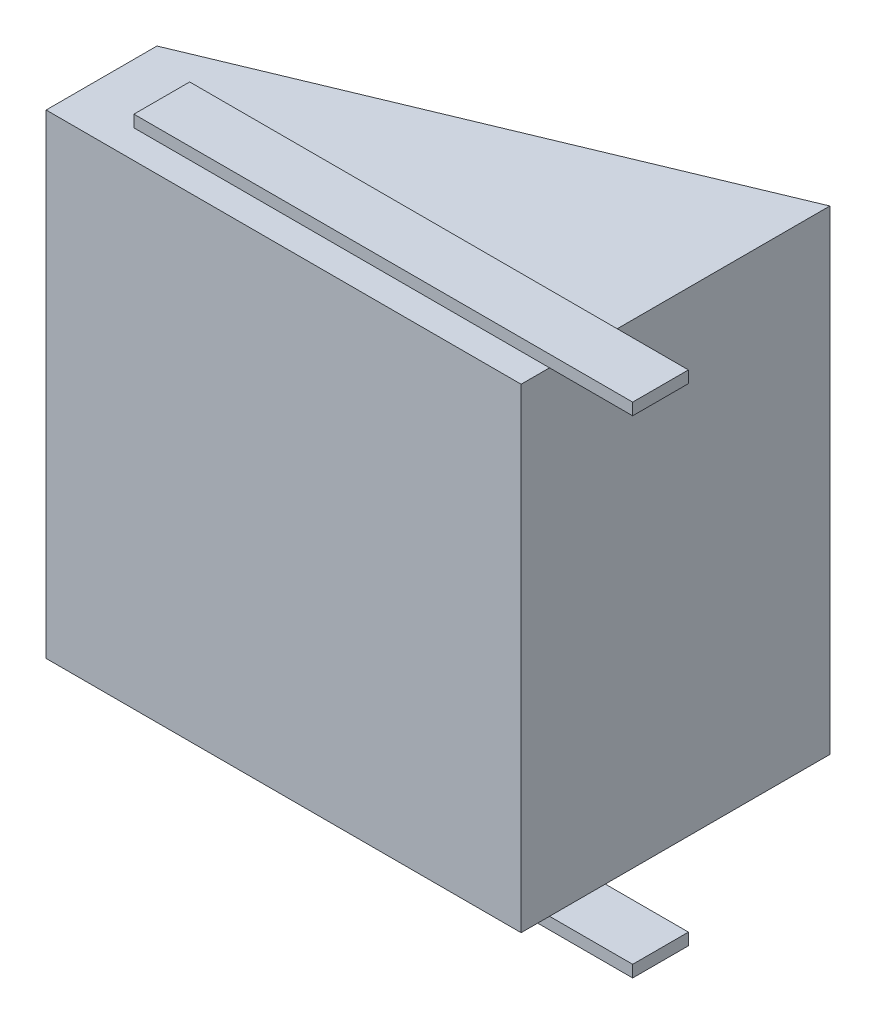
ISO-10303-21;
HEADER;
FILE_DESCRIPTION(('STEP AP214'),'2;1');
FILE_NAME('part.step','',(''),(''),'','','');
FILE_SCHEMA(('AUTOMOTIVE_DESIGN { 1 0 10303 214 1 1 1 1 }'));
ENDSEC;
DATA;
#1=APPLICATION_CONTEXT('core data for automotive mechanical design processes');
#2=APPLICATION_PROTOCOL_DEFINITION('international standard','automotive_design',2000,#1);
#3=PRODUCT_CONTEXT('',#1,'mechanical');
#4=PRODUCT('Part','Part','',(#3));
#5=PRODUCT_RELATED_PRODUCT_CATEGORY('part','',(#4));
#6=PRODUCT_DEFINITION_FORMATION('','',#4);
#7=PRODUCT_DEFINITION_CONTEXT('part definition',#1,'design');
#8=PRODUCT_DEFINITION('design','',#6,#7);
#9=PRODUCT_DEFINITION_SHAPE('','',#8);
#10=(LENGTH_UNIT() NAMED_UNIT(*) SI_UNIT(.MILLI.,.METRE.));
#11=(NAMED_UNIT(*) PLANE_ANGLE_UNIT() SI_UNIT($,.RADIAN.));
#12=(NAMED_UNIT(*) SI_UNIT($,.STERADIAN.) SOLID_ANGLE_UNIT());
#13=UNCERTAINTY_MEASURE_WITH_UNIT(LENGTH_MEASURE(1.E-05),#10,'distance_accuracy_value','');
#14=(GEOMETRIC_REPRESENTATION_CONTEXT(3) GLOBAL_UNCERTAINTY_ASSIGNED_CONTEXT((#13)) GLOBAL_UNIT_ASSIGNED_CONTEXT((#10,
#11,#12)) REPRESENTATION_CONTEXT('',''));
#15=CARTESIAN_POINT('',(0.,0.,0.));
#16=DIRECTION('',(0.,0.,1.));
#17=DIRECTION('',(1.,0.,0.));
#18=AXIS2_PLACEMENT_3D('',#15,#16,#17);
#19=CARTESIAN_POINT('',(10.,82.,-2.78657743681295));
#20=DIRECTION('',(0.,0.,-1.));
#21=DIRECTION('',(-1.,0.,0.));
#22=AXIS2_PLACEMENT_3D('',#19,#20,#21);
#23=PLANE('',#22);
#24=DIRECTION('',(1.,0.,0.));
#25=VECTOR('',#24,1.);
#26=CARTESIAN_POINT('',(0.,80.,-2.78657743681295));
#27=LINE('',#26,#25);
#28=CARTESIAN_POINT('',(10.,80.,-2.78657743681295));
#29=VERTEX_POINT('',#28);
#30=CARTESIAN_POINT('',(80.,80.,-2.78657743681295));
#31=VERTEX_POINT('',#30);
#32=EDGE_CURVE('E213',#29,#31,#27,.T.);
#33=ORIENTED_EDGE('',*,*,#32,.T.);
#34=DIRECTION('',(-1.,0.,0.));
#35=VECTOR('',#34,1.);
#36=CARTESIAN_POINT('',(80.,80.,-2.78657743681295));
#37=LINE('',#36,#35);
#38=CARTESIAN_POINT('',(94.,80.,-2.78657743681295));
#39=VERTEX_POINT('',#38);
#40=EDGE_CURVE('E194',#39,#31,#37,.T.);
#41=ORIENTED_EDGE('',*,*,#40,.F.);
#42=DIRECTION('',(0.,-1.,0.));
#43=VECTOR('',#42,1.);
#44=CARTESIAN_POINT('',(94.,82.,-2.78657743681295));
#45=LINE('',#44,#43);
#46=CARTESIAN_POINT('',(94.,82.,-2.78657743681295));
#47=VERTEX_POINT('',#46);
#48=EDGE_CURVE('E283',#47,#39,#45,.T.);
#49=ORIENTED_EDGE('',*,*,#48,.F.);
#50=DIRECTION('',(1.,0.,0.));
#51=VECTOR('',#50,1.);
#52=CARTESIAN_POINT('',(10.,82.,-2.78657743681295));
#53=LINE('',#52,#51);
#54=CARTESIAN_POINT('',(10.,82.,-2.78657743681295));
#55=VERTEX_POINT('',#54);
#56=EDGE_CURVE('E269',#55,#47,#53,.T.);
#57=ORIENTED_EDGE('',*,*,#56,.F.);
#58=DIRECTION('',(0.,-1.,0.));
#59=VECTOR('',#58,1.);
#60=CARTESIAN_POINT('',(10.,82.,-2.78657743681295));
#61=LINE('',#60,#59);
#62=EDGE_CURVE('E287',#55,#29,#61,.T.);
#63=ORIENTED_EDGE('',*,*,#62,.T.);
#64=EDGE_LOOP('',(#33,#41,#49,#57,#63));
#65=FACE_BOUND('',#64,.T.);
#66=ADVANCED_FACE('F33',(#65),#23,.F.);
#67=CARTESIAN_POINT('',(10.,82.,-12.1785777538674));
#68=DIRECTION('',(0.,0.,1.));
#69=DIRECTION('',(1.,0.,0.));
#70=AXIS2_PLACEMENT_3D('',#67,#68,#69);
#71=PLANE('',#70);
#72=DIRECTION('',(0.,-1.,0.));
#73=VECTOR('',#72,1.);
#74=CARTESIAN_POINT('',(94.,82.,-12.1785777538674));
#75=LINE('',#74,#73);
#76=CARTESIAN_POINT('',(94.,82.,-12.1785777538674));
#77=VERTEX_POINT('',#76);
#78=CARTESIAN_POINT('',(94.,80.,-12.1785777538674));
#79=VERTEX_POINT('',#78);
#80=EDGE_CURVE('E280',#77,#79,#75,.T.);
#81=ORIENTED_EDGE('',*,*,#80,.T.);
#82=DIRECTION('',(-1.,0.,0.));
#83=VECTOR('',#82,1.);
#84=CARTESIAN_POINT('',(10.,80.,-12.1785777538674));
#85=LINE('',#84,#83);
#86=CARTESIAN_POINT('',(80.,80.,-12.1785777538674));
#87=VERTEX_POINT('',#86);
#88=EDGE_CURVE('E251',#79,#87,#85,.T.);
#89=ORIENTED_EDGE('',*,*,#88,.T.);
#90=DIRECTION('',(-1.,0.,0.));
#91=VECTOR('',#90,1.);
#92=CARTESIAN_POINT('',(0.,80.,-12.1785777538674));
#93=LINE('',#92,#91);
#94=CARTESIAN_POINT('',(10.,80.,-12.1785777538674));
#95=VERTEX_POINT('',#94);
#96=EDGE_CURVE('E297',#87,#95,#93,.T.);
#97=ORIENTED_EDGE('',*,*,#96,.T.);
#98=DIRECTION('',(0.,-1.,0.));
#99=VECTOR('',#98,1.);
#100=CARTESIAN_POINT('',(10.,82.,-12.1785777538674));
#101=LINE('',#100,#99);
#102=CARTESIAN_POINT('',(10.,82.,-12.1785777538674));
#103=VERTEX_POINT('',#102);
#104=EDGE_CURVE('E276',#103,#95,#101,.T.);
#105=ORIENTED_EDGE('',*,*,#104,.F.);
#106=DIRECTION('',(-1.,0.,0.));
#107=VECTOR('',#106,1.);
#108=CARTESIAN_POINT('',(10.,82.,-12.1785777538674));
#109=LINE('',#108,#107);
#110=EDGE_CURVE('E273',#77,#103,#109,.T.);
#111=ORIENTED_EDGE('',*,*,#110,.F.);
#112=EDGE_LOOP('',(#81,#89,#97,#105,#111));
#113=FACE_BOUND('',#112,.T.);
#114=ADVANCED_FACE('F392',(#113),#71,.F.);
#115=CARTESIAN_POINT('',(94.,82.,-12.1785777538674));
#116=DIRECTION('',(-1.,0.,0.));
#117=DIRECTION('',(0.,0.,1.));
#118=AXIS2_PLACEMENT_3D('',#115,#116,#117);
#119=PLANE('',#118);
#120=ORIENTED_EDGE('',*,*,#48,.T.);
#121=DIRECTION('',(0.,0.,-1.));
#122=VECTOR('',#121,1.);
#123=CARTESIAN_POINT('',(94.,80.,-12.1785777538674));
#124=LINE('',#123,#122);
#125=EDGE_CURVE('E11',#39,#79,#124,.T.);
#126=ORIENTED_EDGE('',*,*,#125,.T.);
#127=ORIENTED_EDGE('',*,*,#80,.F.);
#128=DIRECTION('',(0.,0.,-1.));
#129=VECTOR('',#128,1.);
#130=CARTESIAN_POINT('',(94.,82.,-12.1785777538674));
#131=LINE('',#130,#129);
#132=EDGE_CURVE('E271',#47,#77,#131,.T.);
#133=ORIENTED_EDGE('',*,*,#132,.F.);
#134=EDGE_LOOP('',(#120,#126,#127,#133));
#135=FACE_BOUND('',#134,.T.);
#136=ADVANCED_FACE('F398',(#135),#119,.F.);
#137=CARTESIAN_POINT('',(80.,78.,-50.));
#138=DIRECTION('',(0.,1.,0.));
#139=DIRECTION('',(0.,0.,1.));
#140=AXIS2_PLACEMENT_3D('',#137,#138,#139);
#141=PLANE('',#140);
#142=DIRECTION('',(-1.,0.,0.));
#143=VECTOR('',#142,1.);
#144=CARTESIAN_POINT('',(80.,78.,-2.78657743681295));
#145=LINE('',#144,#143);
#146=CARTESIAN_POINT('',(78.,78.,-2.78657743681295));
#147=VERTEX_POINT('',#146);
#148=CARTESIAN_POINT('',(9.99999999999999,78.,-2.78657743681295));
#149=VERTEX_POINT('',#148);
#150=EDGE_CURVE('E304',#147,#149,#145,.T.);
#151=ORIENTED_EDGE('',*,*,#150,.F.);
#152=DIRECTION('',(0.,0.,1.));
#153=VECTOR('',#152,1.);
#154=CARTESIAN_POINT('',(78.,78.,-50.));
#155=LINE('',#154,#153);
#156=CARTESIAN_POINT('',(78.,78.,0.));
#157=VERTEX_POINT('',#156);
#158=EDGE_CURVE('E346',#147,#157,#155,.T.);
#159=ORIENTED_EDGE('',*,*,#158,.T.);
#160=DIRECTION('',(-1.,0.,0.));
#161=VECTOR('',#160,1.);
#162=CARTESIAN_POINT('',(80.,78.,0.));
#163=LINE('',#162,#161);
#164=CARTESIAN_POINT('',(2.,78.,0.));
#165=VERTEX_POINT('',#164);
#166=EDGE_CURVE('E356',#157,#165,#163,.T.);
#167=ORIENTED_EDGE('',*,*,#166,.T.);
#168=DIRECTION('',(0.,0.,1.));
#169=VECTOR('',#168,1.);
#170=CARTESIAN_POINT('',(2.,78.,-16.6666666666667));
#171=LINE('',#170,#169);
#172=CARTESIAN_POINT('',(2.,78.,-16.6666666666667));
#173=VERTEX_POINT('',#172);
#174=EDGE_CURVE('E326',#173,#165,#171,.T.);
#175=ORIENTED_EDGE('',*,*,#174,.F.);
#176=DIRECTION('',(1.,0.,0.));
#177=VECTOR('',#176,1.);
#178=CARTESIAN_POINT('',(0.,78.,-16.6666666666667));
#179=LINE('',#178,#177);
#180=CARTESIAN_POINT('',(0.,78.,-16.6666666666667));
#181=VERTEX_POINT('',#180);
#182=EDGE_CURVE('E316',#181,#173,#179,.T.);
#183=ORIENTED_EDGE('',*,*,#182,.F.);
#184=DIRECTION('',(0.923076923076923,0.,-0.384615384615385));
#185=VECTOR('',#184,1.);
#186=CARTESIAN_POINT('',(80.,78.,-50.));
#187=LINE('',#186,#185);
#188=CARTESIAN_POINT('',(78.,78.,-49.1666666666667));
#189=VERTEX_POINT('',#188);
#190=EDGE_CURVE('E337',#181,#189,#187,.T.);
#191=ORIENTED_EDGE('',*,*,#190,.T.);
#192=CARTESIAN_POINT('',(78.,78.,-12.1785777538674));
#193=VERTEX_POINT('',#192);
#194=EDGE_CURVE('E347',#189,#193,#155,.T.);
#195=ORIENTED_EDGE('',*,*,#194,.T.);
#196=DIRECTION('',(1.,0.,0.));
#197=VECTOR('',#196,1.);
#198=CARTESIAN_POINT('',(80.,78.,-12.1785777538674));
#199=LINE('',#198,#197);
#200=CARTESIAN_POINT('',(9.99999999999999,78.,-12.1785777538674));
#201=VERTEX_POINT('',#200);
#202=EDGE_CURVE('E294',#201,#193,#199,.T.);
#203=ORIENTED_EDGE('',*,*,#202,.F.);
#204=DIRECTION('',(0.,0.,-1.));
#205=VECTOR('',#204,1.);
#206=CARTESIAN_POINT('',(9.99999999999998,78.,-50.));
#207=LINE('',#206,#205);
#208=EDGE_CURVE('E56',#149,#201,#207,.T.);
#209=ORIENTED_EDGE('',*,*,#208,.F.);
#210=EDGE_LOOP('',(#151,#159,#167,#175,#183,#191,#195,#203,#209));
#211=FACE_BOUND('',#210,.T.);
#212=ADVANCED_FACE('F457',(#211),#141,.F.);
#213=CARTESIAN_POINT('',(80.,2.,-50.));
#214=DIRECTION('',(0.,-1.,0.));
#215=DIRECTION('',(0.,0.,-1.));
#216=AXIS2_PLACEMENT_3D('',#213,#214,#215);
#217=PLANE('',#216);
#218=DIRECTION('',(1.,0.,0.));
#219=VECTOR('',#218,1.);
#220=CARTESIAN_POINT('',(80.,2.,-2.78657743681295));
#221=LINE('',#220,#219);
#222=CARTESIAN_POINT('',(9.99999999999999,2.,-2.78657743681295));
#223=VERTEX_POINT('',#222);
#224=CARTESIAN_POINT('',(78.,2.,-2.78657743681295));
#225=VERTEX_POINT('',#224);
#226=EDGE_CURVE('E301',#223,#225,#221,.T.);
#227=ORIENTED_EDGE('',*,*,#226,.F.);
#228=DIRECTION('',(0.,0.,1.));
#229=VECTOR('',#228,1.);
#230=CARTESIAN_POINT('',(9.99999999999998,2.,-50.));
#231=LINE('',#230,#229);
#232=CARTESIAN_POINT('',(9.99999999999999,2.,-12.1785777538674));
#233=VERTEX_POINT('',#232);
#234=EDGE_CURVE('E309',#233,#223,#231,.T.);
#235=ORIENTED_EDGE('',*,*,#234,.F.);
#236=DIRECTION('',(-1.,0.,0.));
#237=VECTOR('',#236,1.);
#238=CARTESIAN_POINT('',(80.,2.,-12.1785777538674));
#239=LINE('',#238,#237);
#240=CARTESIAN_POINT('',(78.,2.,-12.1785777538674));
#241=VERTEX_POINT('',#240);
#242=EDGE_CURVE('E290',#241,#233,#239,.T.);
#243=ORIENTED_EDGE('',*,*,#242,.F.);
#244=DIRECTION('',(0.,0.,1.));
#245=VECTOR('',#244,1.);
#246=CARTESIAN_POINT('',(78.,2.,-50.));
#247=LINE('',#246,#245);
#248=CARTESIAN_POINT('',(78.,2.,-49.1666666666667));
#249=VERTEX_POINT('',#248);
#250=EDGE_CURVE('E351',#249,#241,#247,.T.);
#251=ORIENTED_EDGE('',*,*,#250,.F.);
#252=DIRECTION('',(-0.923076923076923,0.,0.384615384615385));
#253=VECTOR('',#252,1.);
#254=CARTESIAN_POINT('',(80.,2.,-50.));
#255=LINE('',#254,#253);
#256=CARTESIAN_POINT('',(0.,2.,-16.6666666666667));
#257=VERTEX_POINT('',#256);
#258=EDGE_CURVE('E334',#249,#257,#255,.T.);
#259=ORIENTED_EDGE('',*,*,#258,.T.);
#260=DIRECTION('',(-1.,0.,0.));
#261=VECTOR('',#260,1.);
#262=CARTESIAN_POINT('',(0.,2.,-16.6666666666667));
#263=LINE('',#262,#261);
#264=CARTESIAN_POINT('',(1.99999999999999,2.,-16.6666666666667));
#265=VERTEX_POINT('',#264);
#266=EDGE_CURVE('E320',#265,#257,#263,.T.);
#267=ORIENTED_EDGE('',*,*,#266,.F.);
#268=DIRECTION('',(0.,0.,1.));
#269=VECTOR('',#268,1.);
#270=CARTESIAN_POINT('',(1.99999999999999,2.,-16.6666666666667));
#271=LINE('',#270,#269);
#272=CARTESIAN_POINT('',(1.99999999999999,2.,0.));
#273=VERTEX_POINT('',#272);
#274=EDGE_CURVE('E322',#265,#273,#271,.T.);
#275=ORIENTED_EDGE('',*,*,#274,.T.);
#276=DIRECTION('',(1.,0.,0.));
#277=VECTOR('',#276,1.);
#278=CARTESIAN_POINT('',(80.,2.,0.));
#279=LINE('',#278,#277);
#280=CARTESIAN_POINT('',(78.,2.,0.));
#281=VERTEX_POINT('',#280);
#282=EDGE_CURVE('E353',#273,#281,#279,.T.);
#283=ORIENTED_EDGE('',*,*,#282,.T.);
#284=EDGE_CURVE('E350',#225,#281,#247,.T.);
#285=ORIENTED_EDGE('',*,*,#284,.F.);
#286=EDGE_LOOP('',(#227,#235,#243,#251,#259,#267,#275,#283,#285));
#287=FACE_BOUND('',#286,.T.);
#288=ADVANCED_FACE('F450',(#287),#217,.F.);
#289=CARTESIAN_POINT('',(0.,0.,2.));
#290=DIRECTION('',(0.,1.,0.));
#291=DIRECTION('',(0.,0.,1.));
#292=AXIS2_PLACEMENT_3D('',#289,#290,#291);
#293=PLANE('',#292);
#294=DIRECTION('',(-1.,0.,0.));
#295=VECTOR('',#294,1.);
#296=CARTESIAN_POINT('',(0.,0.,-2.78657743681295));
#297=LINE('',#296,#295);
#298=CARTESIAN_POINT('',(80.,0.,-2.78657743681295));
#299=VERTEX_POINT('',#298);
#300=CARTESIAN_POINT('',(10.,0.,-2.78657743681295));
#301=VERTEX_POINT('',#300);
#302=EDGE_CURVE('E201',#299,#301,#297,.T.);
#303=ORIENTED_EDGE('',*,*,#302,.F.);
#304=DIRECTION('',(0.,0.,-1.));
#305=VECTOR('',#304,1.);
#306=CARTESIAN_POINT('',(80.,0.,2.));
#307=LINE('',#306,#305);
#308=CARTESIAN_POINT('',(80.,0.,2.));
#309=VERTEX_POINT('',#308);
#310=EDGE_CURVE('E209',#309,#299,#307,.T.);
#311=ORIENTED_EDGE('',*,*,#310,.F.);
#312=DIRECTION('',(1.,0.,0.));
#313=VECTOR('',#312,1.);
#314=CARTESIAN_POINT('',(0.,0.,2.));
#315=LINE('',#314,#313);
#316=CARTESIAN_POINT('',(0.,0.,2.));
#317=VERTEX_POINT('',#316);
#318=EDGE_CURVE('E365',#317,#309,#315,.T.);
#319=ORIENTED_EDGE('',*,*,#318,.F.);
#320=DIRECTION('',(0.,0.,-1.));
#321=VECTOR('',#320,1.);
#322=CARTESIAN_POINT('',(0.,0.,2.));
#323=LINE('',#322,#321);
#324=CARTESIAN_POINT('',(0.,0.,-16.6666666666667));
#325=VERTEX_POINT('',#324);
#326=EDGE_CURVE('E219',#317,#325,#323,.T.);
#327=ORIENTED_EDGE('',*,*,#326,.T.);
#328=DIRECTION('',(0.923076923076923,0.,-0.384615384615385));
#329=VECTOR('',#328,1.);
#330=CARTESIAN_POINT('',(-6.62721893491124,0.,-13.905325443787));
#331=LINE('',#330,#329);
#332=CARTESIAN_POINT('',(80.,0.,-50.));
#333=VERTEX_POINT('',#332);
#334=EDGE_CURVE('E340',#325,#333,#331,.T.);
#335=ORIENTED_EDGE('',*,*,#334,.T.);
#336=CARTESIAN_POINT('',(80.,0.,-12.1785777538674));
#337=VERTEX_POINT('',#336);
#338=EDGE_CURVE('E220',#337,#333,#307,.T.);
#339=ORIENTED_EDGE('',*,*,#338,.F.);
#340=DIRECTION('',(1.,0.,0.));
#341=VECTOR('',#340,1.);
#342=CARTESIAN_POINT('',(0.,0.,-12.1785777538674));
#343=LINE('',#342,#341);
#344=CARTESIAN_POINT('',(10.,0.,-12.1785777538674));
#345=VERTEX_POINT('',#344);
#346=EDGE_CURVE('E250',#345,#337,#343,.T.);
#347=ORIENTED_EDGE('',*,*,#346,.F.);
#348=DIRECTION('',(0.,0.,-1.));
#349=VECTOR('',#348,1.);
#350=CARTESIAN_POINT('',(10.,0.,2.));
#351=LINE('',#350,#349);
#352=EDGE_CURVE('E212',#301,#345,#351,.T.);
#353=ORIENTED_EDGE('',*,*,#352,.F.);
#354=EDGE_LOOP('',(#303,#311,#319,#327,#335,#339,#347,#353));
#355=FACE_BOUND('',#354,.T.);
#356=ADVANCED_FACE('F208',(#355),#293,.F.);
#357=CARTESIAN_POINT('',(80.,0.,2.));
#358=DIRECTION('',(-1.,0.,0.));
#359=DIRECTION('',(0.,0.,1.));
#360=AXIS2_PLACEMENT_3D('',#357,#358,#359);
#361=PLANE('',#360);
#362=DIRECTION('',(0.,0.,-1.));
#363=VECTOR('',#362,1.);
#364=CARTESIAN_POINT('',(80.,80.,2.));
#365=LINE('',#364,#363);
#366=CARTESIAN_POINT('',(80.,80.,-50.));
#367=VERTEX_POINT('',#366);
#368=EDGE_CURVE('E371',#87,#367,#365,.T.);
#369=ORIENTED_EDGE('',*,*,#368,.F.);
#370=DIRECTION('',(0.,0.,1.));
#371=VECTOR('',#370,1.);
#372=CARTESIAN_POINT('',(80.,80.,-52.7865774368129));
#373=LINE('',#372,#371);
#374=EDGE_CURVE('E193',#87,#31,#373,.T.);
#375=ORIENTED_EDGE('',*,*,#374,.T.);
#376=CARTESIAN_POINT('',(80.,80.,2.));
#377=VERTEX_POINT('',#376);
#378=EDGE_CURVE('E225',#377,#31,#365,.T.);
#379=ORIENTED_EDGE('',*,*,#378,.F.);
#380=DIRECTION('',(0.,1.,0.));
#381=VECTOR('',#380,1.);
#382=CARTESIAN_POINT('',(80.,0.,2.));
#383=LINE('',#382,#381);
#384=EDGE_CURVE('E218',#309,#377,#383,.T.);
#385=ORIENTED_EDGE('',*,*,#384,.F.);
#386=ORIENTED_EDGE('',*,*,#310,.T.);
#387=DIRECTION('',(0.,0.,1.));
#388=VECTOR('',#387,1.);
#389=CARTESIAN_POINT('',(80.,0.,-52.7865774368129));
#390=LINE('',#389,#388);
#391=EDGE_CURVE('E186',#337,#299,#390,.T.);
#392=ORIENTED_EDGE('',*,*,#391,.F.);
#393=ORIENTED_EDGE('',*,*,#338,.T.);
#394=DIRECTION('',(0.,-1.,0.));
#395=VECTOR('',#394,1.);
#396=CARTESIAN_POINT('',(80.,80.,-50.));
#397=LINE('',#396,#395);
#398=EDGE_CURVE('E357',#367,#333,#397,.T.);
#399=ORIENTED_EDGE('',*,*,#398,.F.);
#400=EDGE_LOOP('',(#369,#375,#379,#385,#386,#392,#393,#399));
#401=FACE_BOUND('',#400,.T.);
#402=ADVANCED_FACE('F216',(#401),#361,.F.);
#403=CARTESIAN_POINT('',(0.,80.,2.));
#404=DIRECTION('',(0.,-1.,0.));
#405=DIRECTION('',(0.,0.,-1.));
#406=AXIS2_PLACEMENT_3D('',#403,#404,#405);
#407=PLANE('',#406);
#408=ORIENTED_EDGE('',*,*,#32,.F.);
#409=DIRECTION('',(0.,0.,1.));
#410=VECTOR('',#409,1.);
#411=CARTESIAN_POINT('',(10.,80.,2.));
#412=LINE('',#411,#410);
#413=EDGE_CURVE('E237',#95,#29,#412,.T.);
#414=ORIENTED_EDGE('',*,*,#413,.F.);
#415=ORIENTED_EDGE('',*,*,#96,.F.);
#416=ORIENTED_EDGE('',*,*,#368,.T.);
#417=DIRECTION('',(0.923076923076923,0.,-0.384615384615385));
#418=VECTOR('',#417,1.);
#419=CARTESIAN_POINT('',(80.,80.,-50.));
#420=LINE('',#419,#418);
#421=CARTESIAN_POINT('',(0.,80.,-16.6666666666667));
#422=VERTEX_POINT('',#421);
#423=EDGE_CURVE('E328',#422,#367,#420,.T.);
#424=ORIENTED_EDGE('',*,*,#423,.F.);
#425=DIRECTION('',(0.,0.,-1.));
#426=VECTOR('',#425,1.);
#427=CARTESIAN_POINT('',(0.,80.,2.));
#428=LINE('',#427,#426);
#429=CARTESIAN_POINT('',(0.,80.,2.));
#430=VERTEX_POINT('',#429);
#431=EDGE_CURVE('E369',#430,#422,#428,.T.);
#432=ORIENTED_EDGE('',*,*,#431,.F.);
#433=DIRECTION('',(-1.,0.,0.));
#434=VECTOR('',#433,1.);
#435=CARTESIAN_POINT('',(0.,80.,2.));
#436=LINE('',#435,#434);
#437=EDGE_CURVE('E368',#377,#430,#436,.T.);
#438=ORIENTED_EDGE('',*,*,#437,.F.);
#439=ORIENTED_EDGE('',*,*,#378,.T.);
#440=EDGE_LOOP('',(#408,#414,#415,#416,#424,#432,#438,#439));
#441=FACE_BOUND('',#440,.T.);
#442=ADVANCED_FACE('F381',(#441),#407,.F.);
#443=CARTESIAN_POINT('',(78.,78.,-50.));
#444=DIRECTION('',(1.,0.,0.));
#445=DIRECTION('',(0.,1.,0.));
#446=AXIS2_PLACEMENT_3D('',#443,#444,#445);
#447=PLANE('',#446);
#448=DIRECTION('',(0.,1.,0.));
#449=VECTOR('',#448,1.);
#450=CARTESIAN_POINT('',(78.,78.,-2.78657743681295));
#451=LINE('',#450,#449);
#452=EDGE_CURVE('E234',#225,#147,#451,.T.);
#453=ORIENTED_EDGE('',*,*,#452,.F.);
#454=ORIENTED_EDGE('',*,*,#284,.T.);
#455=DIRECTION('',(0.,1.,0.));
#456=VECTOR('',#455,1.);
#457=CARTESIAN_POINT('',(78.,78.,0.));
#458=LINE('',#457,#456);
#459=EDGE_CURVE('E343',#281,#157,#458,.T.);
#460=ORIENTED_EDGE('',*,*,#459,.T.);
#461=ORIENTED_EDGE('',*,*,#158,.F.);
#462=EDGE_LOOP('',(#453,#454,#460,#461));
#463=FACE_BOUND('',#462,.T.);
#464=ADVANCED_FACE('F454',(#463),#447,.F.);
#465=DIRECTION('',(0.,-1.,0.));
#466=VECTOR('',#465,1.);
#467=CARTESIAN_POINT('',(78.,78.,-12.1785777538674));
#468=LINE('',#467,#466);
#469=EDGE_CURVE('E231',#193,#241,#468,.T.);
#470=ORIENTED_EDGE('',*,*,#469,.F.);
#471=ORIENTED_EDGE('',*,*,#194,.F.);
#472=DIRECTION('',(0.,-1.,0.));
#473=VECTOR('',#472,1.);
#474=CARTESIAN_POINT('',(78.,78.,-49.1666666666667));
#475=LINE('',#474,#473);
#476=EDGE_CURVE('E223',#189,#249,#475,.T.);
#477=ORIENTED_EDGE('',*,*,#476,.T.);
#478=ORIENTED_EDGE('',*,*,#250,.T.);
#479=EDGE_LOOP('',(#470,#471,#477,#478));
#480=FACE_BOUND('',#479,.T.);
#481=ADVANCED_FACE('F484',(#480),#447,.F.);
#482=CARTESIAN_POINT('',(0.,0.,0.));
#483=DIRECTION('',(0.,0.,-1.));
#484=DIRECTION('',(-1.,0.,0.));
#485=AXIS2_PLACEMENT_3D('',#482,#483,#484);
#486=PLANE('',#485);
#487=ORIENTED_EDGE('',*,*,#282,.F.);
#488=DIRECTION('',(0.,-1.,0.));
#489=VECTOR('',#488,1.);
#490=CARTESIAN_POINT('',(2.,78.,0.));
#491=LINE('',#490,#489);
#492=EDGE_CURVE('E313',#165,#273,#491,.T.);
#493=ORIENTED_EDGE('',*,*,#492,.F.);
#494=ORIENTED_EDGE('',*,*,#166,.F.);
#495=ORIENTED_EDGE('',*,*,#459,.F.);
#496=EDGE_LOOP('',(#487,#493,#494,#495));
#497=FACE_BOUND('',#496,.T.);
#498=ADVANCED_FACE('F463',(#497),#486,.T.);
#499=CARTESIAN_POINT('',(0.,0.,2.));
#500=DIRECTION('',(1.,0.,0.));
#501=DIRECTION('',(0.,0.,-1.));
#502=AXIS2_PLACEMENT_3D('',#499,#500,#501);
#503=PLANE('',#502);
#504=ORIENTED_EDGE('',*,*,#431,.T.);
#505=DIRECTION('',(0.,1.,0.));
#506=VECTOR('',#505,1.);
#507=CARTESIAN_POINT('',(0.,-20.,-16.6666666666667));
#508=LINE('',#507,#506);
#509=EDGE_CURVE('E331',#181,#422,#508,.T.);
#510=ORIENTED_EDGE('',*,*,#509,.F.);
#511=DIRECTION('',(0.,1.,0.));
#512=VECTOR('',#511,1.);
#513=CARTESIAN_POINT('',(0.,78.,-16.6666666666667));
#514=LINE('',#513,#512);
#515=EDGE_CURVE('E314',#257,#181,#514,.T.);
#516=ORIENTED_EDGE('',*,*,#515,.F.);
#517=EDGE_CURVE('E333',#325,#257,#508,.T.);
#518=ORIENTED_EDGE('',*,*,#517,.F.);
#519=ORIENTED_EDGE('',*,*,#326,.F.);
#520=DIRECTION('',(0.,-1.,0.));
#521=VECTOR('',#520,1.);
#522=CARTESIAN_POINT('',(0.,0.,2.));
#523=LINE('',#522,#521);
#524=EDGE_CURVE('E360',#430,#317,#523,.T.);
#525=ORIENTED_EDGE('',*,*,#524,.F.);
#526=EDGE_LOOP('',(#504,#510,#516,#518,#519,#525));
#527=FACE_BOUND('',#526,.T.);
#528=ADVANCED_FACE('F35',(#527),#503,.F.);
#529=CARTESIAN_POINT('',(0.,0.,2.));
#530=DIRECTION('',(0.,0.,-1.));
#531=DIRECTION('',(-1.,0.,0.));
#532=AXIS2_PLACEMENT_3D('',#529,#530,#531);
#533=PLANE('',#532);
#534=ORIENTED_EDGE('',*,*,#524,.T.);
#535=ORIENTED_EDGE('',*,*,#318,.T.);
#536=ORIENTED_EDGE('',*,*,#384,.T.);
#537=ORIENTED_EDGE('',*,*,#437,.T.);
#538=EDGE_LOOP('',(#534,#535,#536,#537));
#539=FACE_BOUND('',#538,.T.);
#540=ADVANCED_FACE('F479',(#539),#533,.F.);
#541=CARTESIAN_POINT('',(80.,-20.,-50.));
#542=DIRECTION('',(0.384615384615385,0.,0.923076923076923));
#543=DIRECTION('',(0.923076923076923,0.,-0.384615384615385));
#544=AXIS2_PLACEMENT_3D('',#541,#542,#543);
#545=PLANE('',#544);
#546=ORIENTED_EDGE('',*,*,#517,.T.);
#547=ORIENTED_EDGE('',*,*,#258,.F.);
#548=ORIENTED_EDGE('',*,*,#476,.F.);
#549=ORIENTED_EDGE('',*,*,#190,.F.);
#550=ORIENTED_EDGE('',*,*,#509,.T.);
#551=ORIENTED_EDGE('',*,*,#423,.T.);
#552=ORIENTED_EDGE('',*,*,#398,.T.);
#553=ORIENTED_EDGE('',*,*,#334,.F.);
#554=EDGE_LOOP('',(#546,#547,#548,#549,#550,#551,#552,#553));
#555=FACE_BOUND('',#554,.T.);
#556=ADVANCED_FACE('F476',(#555),#545,.F.);
#557=CARTESIAN_POINT('',(2.,78.,-16.6666666666667));
#558=DIRECTION('',(-1.,0.,0.));
#559=DIRECTION('',(0.,-1.,0.));
#560=AXIS2_PLACEMENT_3D('',#557,#558,#559);
#561=PLANE('',#560);
#562=ORIENTED_EDGE('',*,*,#492,.T.);
#563=ORIENTED_EDGE('',*,*,#274,.F.);
#564=DIRECTION('',(0.,-1.,0.));
#565=VECTOR('',#564,1.);
#566=CARTESIAN_POINT('',(2.,78.,-16.6666666666667));
#567=LINE('',#566,#565);
#568=EDGE_CURVE('E318',#173,#265,#567,.T.);
#569=ORIENTED_EDGE('',*,*,#568,.F.);
#570=ORIENTED_EDGE('',*,*,#174,.T.);
#571=EDGE_LOOP('',(#562,#563,#569,#570));
#572=FACE_BOUND('',#571,.T.);
#573=ADVANCED_FACE('F466',(#572),#561,.F.);
#574=CARTESIAN_POINT('',(0.,0.,-16.6666666666667));
#575=DIRECTION('',(0.,0.,1.));
#576=DIRECTION('',(1.,0.,0.));
#577=AXIS2_PLACEMENT_3D('',#574,#575,#576);
#578=PLANE('',#577);
#579=ORIENTED_EDGE('',*,*,#515,.T.);
#580=ORIENTED_EDGE('',*,*,#182,.T.);
#581=ORIENTED_EDGE('',*,*,#568,.T.);
#582=ORIENTED_EDGE('',*,*,#266,.T.);
#583=EDGE_LOOP('',(#579,#580,#581,#582));
#584=FACE_BOUND('',#583,.T.);
#585=ADVANCED_FACE('F471',(#584),#578,.F.);
#586=EDGE_CURVE('E279',#201,#233,#101,.T.);
#587=ORIENTED_EDGE('',*,*,#586,.F.);
#588=ORIENTED_EDGE('',*,*,#202,.T.);
#589=ORIENTED_EDGE('',*,*,#469,.T.);
#590=ORIENTED_EDGE('',*,*,#242,.T.);
#591=EDGE_LOOP('',(#587,#588,#589,#590));
#592=FACE_BOUND('',#591,.T.);
#593=ADVANCED_FACE('F419',(#592),#71,.F.);
#594=ORIENTED_EDGE('',*,*,#452,.T.);
#595=ORIENTED_EDGE('',*,*,#150,.T.);
#596=EDGE_CURVE('E291',#149,#223,#61,.T.);
#597=ORIENTED_EDGE('',*,*,#596,.T.);
#598=ORIENTED_EDGE('',*,*,#226,.T.);
#599=EDGE_LOOP('',(#594,#595,#597,#598));
#600=FACE_BOUND('',#599,.T.);
#601=ADVANCED_FACE('F415',(#600),#23,.F.);
#602=CARTESIAN_POINT('',(10.,82.,-12.1785777538674));
#603=DIRECTION('',(1.,0.,0.));
#604=DIRECTION('',(0.,0.,-1.));
#605=AXIS2_PLACEMENT_3D('',#602,#603,#604);
#606=PLANE('',#605);
#607=ORIENTED_EDGE('',*,*,#596,.F.);
#608=ORIENTED_EDGE('',*,*,#208,.T.);
#609=ORIENTED_EDGE('',*,*,#586,.T.);
#610=ORIENTED_EDGE('',*,*,#234,.T.);
#611=EDGE_LOOP('',(#607,#608,#609,#610));
#612=FACE_BOUND('',#611,.T.);
#613=ADVANCED_FACE('F422',(#612),#606,.F.);
#614=CARTESIAN_POINT('',(10.,-2.,-2.78657743681295));
#615=VERTEX_POINT('',#614);
#616=EDGE_CURVE('E286',#301,#615,#61,.T.);
#617=ORIENTED_EDGE('',*,*,#616,.F.);
#618=ORIENTED_EDGE('',*,*,#352,.T.);
#619=CARTESIAN_POINT('',(10.,-2.,-12.1785777538674));
#620=VERTEX_POINT('',#619);
#621=EDGE_CURVE('E275',#345,#620,#101,.T.);
#622=ORIENTED_EDGE('',*,*,#621,.T.);
#623=DIRECTION('',(0.,0.,1.));
#624=VECTOR('',#623,1.);
#625=CARTESIAN_POINT('',(10.,-2.,-12.1785777538674));
#626=LINE('',#625,#624);
#627=EDGE_CURVE('E254',#620,#615,#626,.T.);
#628=ORIENTED_EDGE('',*,*,#627,.T.);
#629=EDGE_LOOP('',(#617,#618,#622,#628));
#630=FACE_BOUND('',#629,.T.);
#631=ADVANCED_FACE('F429',(#630),#606,.F.);
#632=ORIENTED_EDGE('',*,*,#104,.T.);
#633=ORIENTED_EDGE('',*,*,#413,.T.);
#634=ORIENTED_EDGE('',*,*,#62,.F.);
#635=DIRECTION('',(0.,0.,1.));
#636=VECTOR('',#635,1.);
#637=CARTESIAN_POINT('',(10.,82.,-12.1785777538674));
#638=LINE('',#637,#636);
#639=EDGE_CURVE('E266',#103,#55,#638,.T.);
#640=ORIENTED_EDGE('',*,*,#639,.F.);
#641=EDGE_LOOP('',(#632,#633,#634,#640));
#642=FACE_BOUND('',#641,.T.);
#643=ADVANCED_FACE('F389',(#642),#606,.F.);
#644=CARTESIAN_POINT('',(94.,0.,-2.78657743681295));
#645=VERTEX_POINT('',#644);
#646=CARTESIAN_POINT('',(94.,-2.,-2.78657743681295));
#647=VERTEX_POINT('',#646);
#648=EDGE_CURVE('E204',#645,#647,#45,.T.);
#649=ORIENTED_EDGE('',*,*,#648,.F.);
#650=DIRECTION('',(1.,0.,0.));
#651=VECTOR('',#650,1.);
#652=CARTESIAN_POINT('',(80.,0.,-2.78657743681295));
#653=LINE('',#652,#651);
#654=EDGE_CURVE('E48',#299,#645,#653,.T.);
#655=ORIENTED_EDGE('',*,*,#654,.F.);
#656=ORIENTED_EDGE('',*,*,#302,.T.);
#657=ORIENTED_EDGE('',*,*,#616,.T.);
#658=DIRECTION('',(1.,0.,0.));
#659=VECTOR('',#658,1.);
#660=CARTESIAN_POINT('',(10.,-2.,-2.78657743681295));
#661=LINE('',#660,#659);
#662=EDGE_CURVE('E260',#615,#647,#661,.T.);
#663=ORIENTED_EDGE('',*,*,#662,.T.);
#664=EDGE_LOOP('',(#649,#655,#656,#657,#663));
#665=FACE_BOUND('',#664,.T.);
#666=ADVANCED_FACE('F200',(#665),#23,.F.);
#667=ORIENTED_EDGE('',*,*,#346,.T.);
#668=DIRECTION('',(1.,0.,0.));
#669=VECTOR('',#668,1.);
#670=CARTESIAN_POINT('',(10.,0.,-12.1785777538674));
#671=LINE('',#670,#669);
#672=CARTESIAN_POINT('',(94.,0.,-12.1785777538674));
#673=VERTEX_POINT('',#672);
#674=EDGE_CURVE('E189',#337,#673,#671,.T.);
#675=ORIENTED_EDGE('',*,*,#674,.T.);
#676=CARTESIAN_POINT('',(94.,-2.,-12.1785777538674));
#677=VERTEX_POINT('',#676);
#678=EDGE_CURVE('E244',#673,#677,#75,.T.);
#679=ORIENTED_EDGE('',*,*,#678,.T.);
#680=DIRECTION('',(-1.,0.,0.));
#681=VECTOR('',#680,1.);
#682=CARTESIAN_POINT('',(10.,-2.,-12.1785777538674));
#683=LINE('',#682,#681);
#684=EDGE_CURVE('E264',#677,#620,#683,.T.);
#685=ORIENTED_EDGE('',*,*,#684,.T.);
#686=ORIENTED_EDGE('',*,*,#621,.F.);
#687=EDGE_LOOP('',(#667,#675,#679,#685,#686));
#688=FACE_BOUND('',#687,.T.);
#689=ADVANCED_FACE('F247',(#688),#71,.F.);
#690=ORIENTED_EDGE('',*,*,#678,.F.);
#691=DIRECTION('',(0.,0.,1.));
#692=VECTOR('',#691,1.);
#693=CARTESIAN_POINT('',(94.,0.,-12.1785777538674));
#694=LINE('',#693,#692);
#695=EDGE_CURVE('E41',#673,#645,#694,.T.);
#696=ORIENTED_EDGE('',*,*,#695,.T.);
#697=ORIENTED_EDGE('',*,*,#648,.T.);
#698=DIRECTION('',(0.,0.,-1.));
#699=VECTOR('',#698,1.);
#700=CARTESIAN_POINT('',(94.,-2.,-12.1785777538674));
#701=LINE('',#700,#699);
#702=EDGE_CURVE('E262',#647,#677,#701,.T.);
#703=ORIENTED_EDGE('',*,*,#702,.T.);
#704=EDGE_LOOP('',(#690,#696,#697,#703));
#705=FACE_BOUND('',#704,.T.);
#706=ADVANCED_FACE('F241',(#705),#119,.F.);
#707=CARTESIAN_POINT('',(0.,82.,0.));
#708=DIRECTION('',(0.,1.,0.));
#709=DIRECTION('',(0.,0.,1.));
#710=AXIS2_PLACEMENT_3D('',#707,#708,#709);
#711=PLANE('',#710);
#712=ORIENTED_EDGE('',*,*,#639,.T.);
#713=ORIENTED_EDGE('',*,*,#56,.T.);
#714=ORIENTED_EDGE('',*,*,#132,.T.);
#715=ORIENTED_EDGE('',*,*,#110,.T.);
#716=EDGE_LOOP('',(#712,#713,#714,#715));
#717=FACE_BOUND('',#716,.T.);
#718=ADVANCED_FACE('F401',(#717),#711,.T.);
#719=CARTESIAN_POINT('',(0.,-2.,0.));
#720=DIRECTION('',(0.,1.,0.));
#721=DIRECTION('',(0.,0.,1.));
#722=AXIS2_PLACEMENT_3D('',#719,#720,#721);
#723=PLANE('',#722);
#724=ORIENTED_EDGE('',*,*,#627,.F.);
#725=ORIENTED_EDGE('',*,*,#684,.F.);
#726=ORIENTED_EDGE('',*,*,#702,.F.);
#727=ORIENTED_EDGE('',*,*,#662,.F.);
#728=EDGE_LOOP('',(#724,#725,#726,#727));
#729=FACE_BOUND('',#728,.T.);
#730=ADVANCED_FACE('F403',(#729),#723,.F.);
#731=CARTESIAN_POINT('',(80.,80.,-52.7865774368129));
#732=DIRECTION('',(0.,1.,0.));
#733=DIRECTION('',(0.,0.,1.));
#734=AXIS2_PLACEMENT_3D('',#731,#732,#733);
#735=PLANE('',#734);
#736=ORIENTED_EDGE('',*,*,#125,.F.);
#737=ORIENTED_EDGE('',*,*,#40,.T.);
#738=ORIENTED_EDGE('',*,*,#374,.F.);
#739=ORIENTED_EDGE('',*,*,#88,.F.);
#740=EDGE_LOOP('',(#736,#737,#738,#739));
#741=FACE_BOUND('',#740,.T.);
#742=ADVANCED_FACE('F396',(#741),#735,.F.);
#743=CARTESIAN_POINT('',(80.,0.,-52.7865774368129));
#744=DIRECTION('',(0.,-1.,0.));
#745=DIRECTION('',(0.,0.,-1.));
#746=AXIS2_PLACEMENT_3D('',#743,#744,#745);
#747=PLANE('',#746);
#748=ORIENTED_EDGE('',*,*,#391,.T.);
#749=ORIENTED_EDGE('',*,*,#654,.T.);
#750=ORIENTED_EDGE('',*,*,#695,.F.);
#751=ORIENTED_EDGE('',*,*,#674,.F.);
#752=EDGE_LOOP('',(#748,#749,#750,#751));
#753=FACE_BOUND('',#752,.T.);
#754=ADVANCED_FACE('F187',(#753),#747,.F.);
#755=CLOSED_SHELL('',(#66,#114,#136,#212,#288,#356,#402,#442,#464,#481,#498,#528,#540,#556,#573,
#585,#593,#601,#613,#631,#643,#666,#689,#706,#718,#730,#742,#754));
#756=MANIFOLD_SOLID_BREP('B2',#755);
#757=ADVANCED_BREP_SHAPE_REPRESENTATION('',(#18,#756),#14);
#758=SHAPE_DEFINITION_REPRESENTATION(#9,#757);
ENDSEC;
END-ISO-10303-21;
